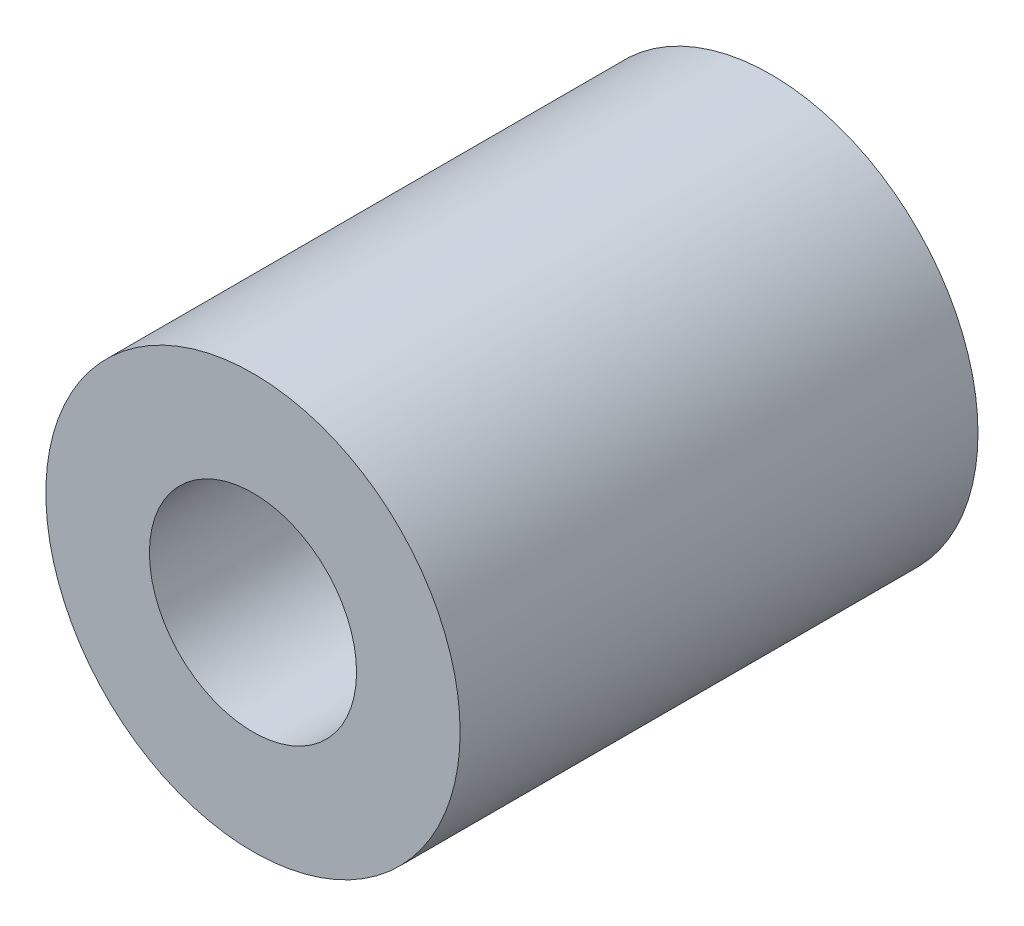
ISO-10303-21;
HEADER;
FILE_DESCRIPTION(('STEP AP214'),'2;1');
FILE_NAME('part.step','',(''),(''),'','','');
FILE_SCHEMA(('AUTOMOTIVE_DESIGN { 1 0 10303 214 1 1 1 1 }'));
ENDSEC;
DATA;
#1=APPLICATION_CONTEXT('core data for automotive mechanical design processes');
#2=APPLICATION_PROTOCOL_DEFINITION('international standard','automotive_design',2000,#1);
#3=PRODUCT_CONTEXT('',#1,'mechanical');
#4=PRODUCT('Part','Part','',(#3));
#5=PRODUCT_RELATED_PRODUCT_CATEGORY('part','',(#4));
#6=PRODUCT_DEFINITION_FORMATION('','',#4);
#7=PRODUCT_DEFINITION_CONTEXT('part definition',#1,'design');
#8=PRODUCT_DEFINITION('design','',#6,#7);
#9=PRODUCT_DEFINITION_SHAPE('','',#8);
#10=(LENGTH_UNIT() NAMED_UNIT(*) SI_UNIT(.MILLI.,.METRE.));
#11=(NAMED_UNIT(*) PLANE_ANGLE_UNIT() SI_UNIT($,.RADIAN.));
#12=(NAMED_UNIT(*) SI_UNIT($,.STERADIAN.) SOLID_ANGLE_UNIT());
#13=UNCERTAINTY_MEASURE_WITH_UNIT(LENGTH_MEASURE(1.E-05),#10,'distance_accuracy_value','');
#14=(GEOMETRIC_REPRESENTATION_CONTEXT(3) GLOBAL_UNCERTAINTY_ASSIGNED_CONTEXT((#13)) GLOBAL_UNIT_ASSIGNED_CONTEXT((#10,
#11,#12)) REPRESENTATION_CONTEXT('',''));
#15=CARTESIAN_POINT('',(0.,0.,0.));
#16=DIRECTION('',(0.,0.,1.));
#17=DIRECTION('',(1.,0.,0.));
#18=AXIS2_PLACEMENT_3D('',#15,#16,#17);
#19=CARTESIAN_POINT('',(0.,0.,10.));
#20=DIRECTION('',(0.,0.,1.));
#21=DIRECTION('',(1.,0.,0.));
#22=AXIS2_PLACEMENT_3D('',#19,#20,#21);
#23=PLANE('',#22);
#24=CARTESIAN_POINT('',(0.,0.,10.));
#25=DIRECTION('',(0.,0.,1.));
#26=DIRECTION('',(1.,0.,0.));
#27=AXIS2_PLACEMENT_3D('',#24,#25,#26);
#28=CIRCLE('',#27,8.);
#29=CARTESIAN_POINT('',(8.,0.,10.));
#30=VERTEX_POINT('',#29);
#31=EDGE_CURVE('E10',#30,#30,#28,.T.);
#32=ORIENTED_EDGE('',*,*,#31,.T.);
#33=EDGE_LOOP('',(#32));
#34=FACE_BOUND('',#33,.T.);
#35=CARTESIAN_POINT('',(0.,0.,10.));
#36=DIRECTION('',(0.,0.,1.));
#37=DIRECTION('',(1.,0.,0.));
#38=AXIS2_PLACEMENT_3D('',#35,#36,#37);
#39=CIRCLE('',#38,4.);
#40=CARTESIAN_POINT('',(4.,0.,10.));
#41=VERTEX_POINT('',#40);
#42=EDGE_CURVE('E48',#41,#41,#39,.T.);
#43=ORIENTED_EDGE('',*,*,#42,.F.);
#44=EDGE_LOOP('',(#43));
#45=FACE_BOUND('',#44,.T.);
#46=ADVANCED_FACE('F37',(#34,#45),#23,.T.);
#47=CARTESIAN_POINT('',(0.,0.,-10.));
#48=DIRECTION('',(0.,0.,1.));
#49=DIRECTION('',(1.,0.,0.));
#50=AXIS2_PLACEMENT_3D('',#47,#48,#49);
#51=PLANE('',#50);
#52=CARTESIAN_POINT('',(0.,0.,-10.));
#53=DIRECTION('',(0.,0.,1.));
#54=DIRECTION('',(1.,0.,0.));
#55=AXIS2_PLACEMENT_3D('',#52,#53,#54);
#56=CIRCLE('',#55,8.);
#57=CARTESIAN_POINT('',(8.,0.,-10.));
#58=VERTEX_POINT('',#57);
#59=EDGE_CURVE('E41',#58,#58,#56,.T.);
#60=ORIENTED_EDGE('',*,*,#59,.F.);
#61=EDGE_LOOP('',(#60));
#62=FACE_BOUND('',#61,.T.);
#63=CARTESIAN_POINT('',(0.,0.,-10.));
#64=DIRECTION('',(0.,0.,1.));
#65=DIRECTION('',(1.,0.,0.));
#66=AXIS2_PLACEMENT_3D('',#63,#64,#65);
#67=CIRCLE('',#66,4.);
#68=CARTESIAN_POINT('',(4.,0.,-10.));
#69=VERTEX_POINT('',#68);
#70=EDGE_CURVE('E50',#69,#69,#67,.T.);
#71=ORIENTED_EDGE('',*,*,#70,.T.);
#72=EDGE_LOOP('',(#71));
#73=FACE_BOUND('',#72,.T.);
#74=ADVANCED_FACE('F60',(#62,#73),#51,.F.);
#75=CARTESIAN_POINT('',(0.,0.,10.));
#76=DIRECTION('',(0.,0.,-1.));
#77=DIRECTION('',(-1.,0.,0.));
#78=AXIS2_PLACEMENT_3D('',#75,#76,#77);
#79=CYLINDRICAL_SURFACE('',#78,8.);
#80=ORIENTED_EDGE('',*,*,#31,.F.);
#81=EDGE_LOOP('',(#80));
#82=FACE_BOUND('',#81,.T.);
#83=ORIENTED_EDGE('',*,*,#59,.T.);
#84=EDGE_LOOP('',(#83));
#85=FACE_BOUND('',#84,.T.);
#86=ADVANCED_FACE('F39',(#82,#85),#79,.T.);
#87=CARTESIAN_POINT('',(0.,0.,10.));
#88=DIRECTION('',(0.,0.,-1.));
#89=DIRECTION('',(-1.,0.,0.));
#90=AXIS2_PLACEMENT_3D('',#87,#88,#89);
#91=CYLINDRICAL_SURFACE('',#90,4.);
#92=ORIENTED_EDGE('',*,*,#42,.T.);
#93=EDGE_LOOP('',(#92));
#94=FACE_BOUND('',#93,.T.);
#95=ORIENTED_EDGE('',*,*,#70,.F.);
#96=EDGE_LOOP('',(#95));
#97=FACE_BOUND('',#96,.T.);
#98=ADVANCED_FACE('F56',(#94,#97),#91,.F.);
#99=CLOSED_SHELL('',(#46,#74,#86,#98));
#100=MANIFOLD_SOLID_BREP('B2',#99);
#101=ADVANCED_BREP_SHAPE_REPRESENTATION('',(#18,#100),#14);
#102=SHAPE_DEFINITION_REPRESENTATION(#9,#101);
ENDSEC;
END-ISO-10303-21;
